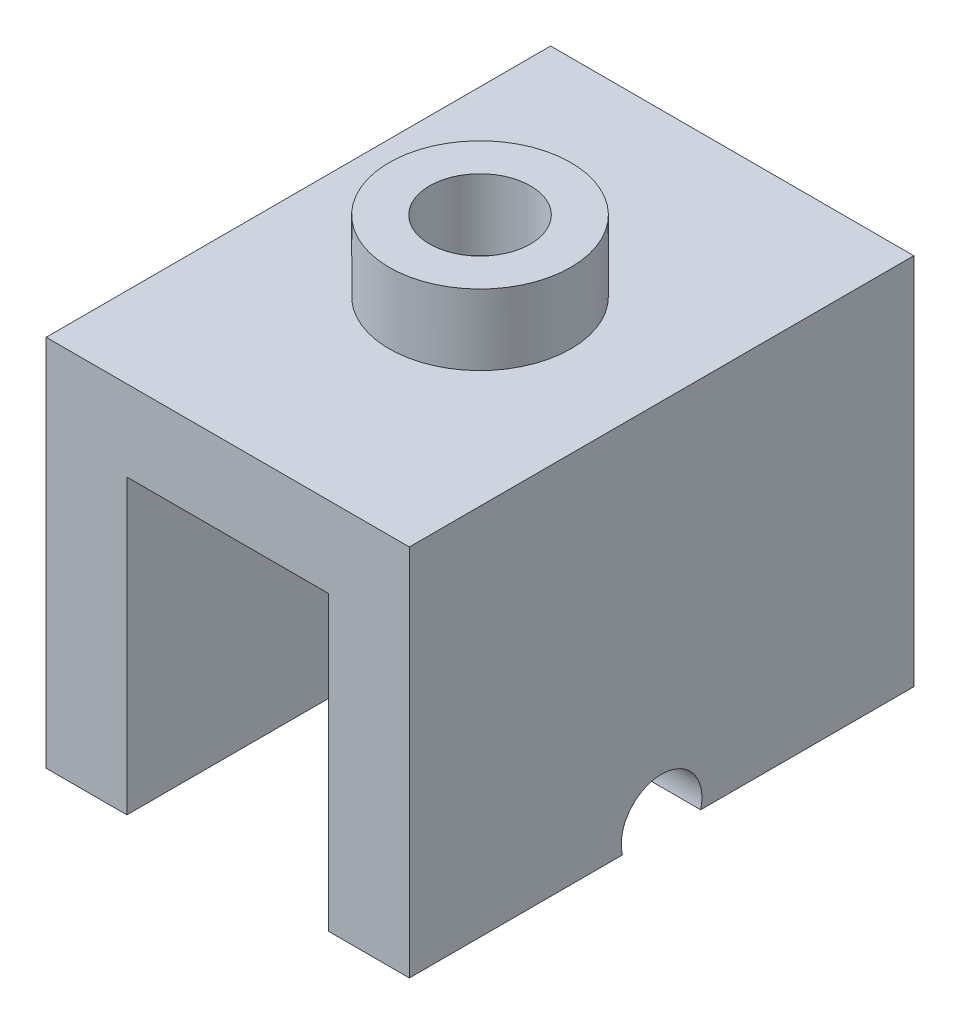
ISO-10303-21;
HEADER;
FILE_DESCRIPTION(('STEP AP214'),'2;1');
FILE_NAME('part.step','',(''),(''),'','','');
FILE_SCHEMA(('AUTOMOTIVE_DESIGN { 1 0 10303 214 1 1 1 1 }'));
ENDSEC;
DATA;
#1=APPLICATION_CONTEXT('core data for automotive mechanical design processes');
#2=APPLICATION_PROTOCOL_DEFINITION('international standard','automotive_design',2000,#1);
#3=PRODUCT_CONTEXT('',#1,'mechanical');
#4=PRODUCT('Part','Part','',(#3));
#5=PRODUCT_RELATED_PRODUCT_CATEGORY('part','',(#4));
#6=PRODUCT_DEFINITION_FORMATION('','',#4);
#7=PRODUCT_DEFINITION_CONTEXT('part definition',#1,'design');
#8=PRODUCT_DEFINITION('design','',#6,#7);
#9=PRODUCT_DEFINITION_SHAPE('','',#8);
#10=(LENGTH_UNIT() NAMED_UNIT(*) SI_UNIT(.MILLI.,.METRE.));
#11=(NAMED_UNIT(*) PLANE_ANGLE_UNIT() SI_UNIT($,.RADIAN.));
#12=(NAMED_UNIT(*) SI_UNIT($,.STERADIAN.) SOLID_ANGLE_UNIT());
#13=UNCERTAINTY_MEASURE_WITH_UNIT(LENGTH_MEASURE(1.E-05),#10,'distance_accuracy_value','');
#14=(GEOMETRIC_REPRESENTATION_CONTEXT(3) GLOBAL_UNCERTAINTY_ASSIGNED_CONTEXT((#13)) GLOBAL_UNIT_ASSIGNED_CONTEXT((#10,
#11,#12)) REPRESENTATION_CONTEXT('',''));
#15=CARTESIAN_POINT('',(0.,0.,0.));
#16=DIRECTION('',(0.,0.,1.));
#17=DIRECTION('',(1.,0.,0.));
#18=AXIS2_PLACEMENT_3D('',#15,#16,#17);
#19=CARTESIAN_POINT('',(-5.,-18.5,12.5));
#20=DIRECTION('',(0.,1.,0.));
#21=DIRECTION('',(0.,0.,1.));
#22=AXIS2_PLACEMENT_3D('',#19,#20,#21);
#23=PLANE('',#22);
#24=DIRECTION('',(0.,0.,-1.));
#25=VECTOR('',#24,1.);
#26=CARTESIAN_POINT('',(-9.,-18.5,12.5));
#27=LINE('',#26,#25);
#28=CARTESIAN_POINT('',(-9.,-18.5,12.5));
#29=VERTEX_POINT('',#28);
#30=CARTESIAN_POINT('',(-9.,-18.5,1.93649167310372));
#31=VERTEX_POINT('',#30);
#32=EDGE_CURVE('E147',#29,#31,#27,.T.);
#33=ORIENTED_EDGE('',*,*,#32,.T.);
#34=DIRECTION('',(1.,0.,0.));
#35=VECTOR('',#34,1.);
#36=CARTESIAN_POINT('',(-14.6568542494924,-18.5,1.93649167310372));
#37=LINE('',#36,#35);
#38=CARTESIAN_POINT('',(-5.,-18.5,1.93649167310371));
#39=VERTEX_POINT('',#38);
#40=EDGE_CURVE('E128',#31,#39,#37,.T.);
#41=ORIENTED_EDGE('',*,*,#40,.T.);
#42=DIRECTION('',(0.,0.,-1.));
#43=VECTOR('',#42,1.);
#44=CARTESIAN_POINT('',(-5.,-18.5,12.5));
#45=LINE('',#44,#43);
#46=CARTESIAN_POINT('',(-5.,-18.5,12.5));
#47=VERTEX_POINT('',#46);
#48=EDGE_CURVE('E148',#47,#39,#45,.T.);
#49=ORIENTED_EDGE('',*,*,#48,.F.);
#50=DIRECTION('',(1.,0.,0.));
#51=VECTOR('',#50,1.);
#52=CARTESIAN_POINT('',(-5.,-18.5,12.5));
#53=LINE('',#52,#51);
#54=EDGE_CURVE('E246',#29,#47,#53,.T.);
#55=ORIENTED_EDGE('',*,*,#54,.F.);
#56=EDGE_LOOP('',(#33,#41,#49,#55));
#57=FACE_BOUND('',#56,.T.);
#58=ADVANCED_FACE('F39',(#57),#23,.F.);
#59=CARTESIAN_POINT('',(9.,-18.5,12.5));
#60=DIRECTION('',(0.,1.,0.));
#61=DIRECTION('',(0.,0.,1.));
#62=AXIS2_PLACEMENT_3D('',#59,#60,#61);
#63=PLANE('',#62);
#64=DIRECTION('',(0.,0.,-1.));
#65=VECTOR('',#64,1.);
#66=CARTESIAN_POINT('',(5.,-18.5,12.5));
#67=LINE('',#66,#65);
#68=CARTESIAN_POINT('',(5.,-18.5,12.5));
#69=VERTEX_POINT('',#68);
#70=CARTESIAN_POINT('',(5.,-18.5,1.93649167310371));
#71=VERTEX_POINT('',#70);
#72=EDGE_CURVE('E211',#69,#71,#67,.T.);
#73=ORIENTED_EDGE('',*,*,#72,.T.);
#74=DIRECTION('',(1.,0.,0.));
#75=VECTOR('',#74,1.);
#76=CARTESIAN_POINT('',(-14.6568542494924,-18.5,1.93649167310372));
#77=LINE('',#76,#75);
#78=CARTESIAN_POINT('',(9.,-18.5,1.93649167310371));
#79=VERTEX_POINT('',#78);
#80=EDGE_CURVE('E260',#71,#79,#77,.T.);
#81=ORIENTED_EDGE('',*,*,#80,.T.);
#82=DIRECTION('',(0.,0.,-1.));
#83=VECTOR('',#82,1.);
#84=CARTESIAN_POINT('',(9.,-18.5,12.5));
#85=LINE('',#84,#83);
#86=CARTESIAN_POINT('',(9.,-18.5,12.5));
#87=VERTEX_POINT('',#86);
#88=EDGE_CURVE('E207',#87,#79,#85,.T.);
#89=ORIENTED_EDGE('',*,*,#88,.F.);
#90=DIRECTION('',(1.,0.,0.));
#91=VECTOR('',#90,1.);
#92=CARTESIAN_POINT('',(9.,-18.5,12.5));
#93=LINE('',#92,#91);
#94=EDGE_CURVE('E237',#69,#87,#93,.T.);
#95=ORIENTED_EDGE('',*,*,#94,.F.);
#96=EDGE_LOOP('',(#73,#81,#89,#95));
#97=FACE_BOUND('',#96,.T.);
#98=ADVANCED_FACE('F269',(#97),#63,.F.);
#99=CARTESIAN_POINT('',(-9.,-18.5,12.5));
#100=DIRECTION('',(1.,0.,0.));
#101=DIRECTION('',(0.,1.,0.));
#102=AXIS2_PLACEMENT_3D('',#99,#100,#101);
#103=PLANE('',#102);
#104=CARTESIAN_POINT('',(-9.,-18.5,-1.93649167310372));
#105=VERTEX_POINT('',#104);
#106=CARTESIAN_POINT('',(-9.,-18.5,-12.5));
#107=VERTEX_POINT('',#106);
#108=EDGE_CURVE('E138',#105,#107,#27,.T.);
#109=ORIENTED_EDGE('',*,*,#108,.F.);
#110=CARTESIAN_POINT('',(-9.,-18.,0.));
#111=DIRECTION('',(1.,0.,0.));
#112=DIRECTION('',(0.,1.,0.));
#113=AXIS2_PLACEMENT_3D('',#110,#111,#112);
#114=CIRCLE('',#113,2.00000000000001);
#115=EDGE_CURVE('E125',#31,#105,#114,.F.);
#116=ORIENTED_EDGE('',*,*,#115,.F.);
#117=ORIENTED_EDGE('',*,*,#32,.F.);
#118=DIRECTION('',(0.,-1.,0.));
#119=VECTOR('',#118,1.);
#120=CARTESIAN_POINT('',(-9.,-18.5,12.5));
#121=LINE('',#120,#119);
#122=CARTESIAN_POINT('',(-9.,0.,12.5));
#123=VERTEX_POINT('',#122);
#124=EDGE_CURVE('E176',#123,#29,#121,.T.);
#125=ORIENTED_EDGE('',*,*,#124,.F.);
#126=DIRECTION('',(0.,0.,-1.));
#127=VECTOR('',#126,1.);
#128=CARTESIAN_POINT('',(-9.,0.,12.5));
#129=LINE('',#128,#127);
#130=CARTESIAN_POINT('',(-9.,0.,-12.5));
#131=VERTEX_POINT('',#130);
#132=EDGE_CURVE('E170',#123,#131,#129,.T.);
#133=ORIENTED_EDGE('',*,*,#132,.T.);
#134=DIRECTION('',(0.,-1.,0.));
#135=VECTOR('',#134,1.);
#136=CARTESIAN_POINT('',(-9.,-18.5,-12.5));
#137=LINE('',#136,#135);
#138=EDGE_CURVE('E146',#131,#107,#137,.T.);
#139=ORIENTED_EDGE('',*,*,#138,.T.);
#140=EDGE_LOOP('',(#109,#116,#117,#125,#133,#139));
#141=FACE_BOUND('',#140,.T.);
#142=ADVANCED_FACE('F41',(#141),#103,.F.);
#143=CARTESIAN_POINT('',(-5.,-18.5,-1.93649167310371));
#144=VERTEX_POINT('',#143);
#145=CARTESIAN_POINT('',(-5.,-18.5,-12.5));
#146=VERTEX_POINT('',#145);
#147=EDGE_CURVE('E140',#144,#146,#45,.T.);
#148=ORIENTED_EDGE('',*,*,#147,.F.);
#149=DIRECTION('',(1.,0.,0.));
#150=VECTOR('',#149,1.);
#151=CARTESIAN_POINT('',(-14.6568542494924,-18.5,-1.93649167310372));
#152=LINE('',#151,#150);
#153=EDGE_CURVE('E54',#144,#105,#152,.F.);
#154=ORIENTED_EDGE('',*,*,#153,.T.);
#155=ORIENTED_EDGE('',*,*,#108,.T.);
#156=DIRECTION('',(1.,0.,0.));
#157=VECTOR('',#156,1.);
#158=CARTESIAN_POINT('',(-5.,-18.5,-12.5));
#159=LINE('',#158,#157);
#160=EDGE_CURVE('E184',#107,#146,#159,.T.);
#161=ORIENTED_EDGE('',*,*,#160,.T.);
#162=EDGE_LOOP('',(#148,#154,#155,#161));
#163=FACE_BOUND('',#162,.T.);
#164=ADVANCED_FACE('F136',(#163),#23,.F.);
#165=CARTESIAN_POINT('',(-5.,-3.99999999999999,12.5));
#166=DIRECTION('',(-1.,0.,0.));
#167=DIRECTION('',(0.,0.,1.));
#168=AXIS2_PLACEMENT_3D('',#165,#166,#167);
#169=PLANE('',#168);
#170=ORIENTED_EDGE('',*,*,#48,.T.);
#171=CARTESIAN_POINT('',(-5.,-18.,0.));
#172=DIRECTION('',(-1.,0.,0.));
#173=DIRECTION('',(0.,0.,1.));
#174=AXIS2_PLACEMENT_3D('',#171,#172,#173);
#175=CIRCLE('',#174,2.00000000000001);
#176=EDGE_CURVE('E141',#39,#144,#175,.T.);
#177=ORIENTED_EDGE('',*,*,#176,.T.);
#178=ORIENTED_EDGE('',*,*,#147,.T.);
#179=DIRECTION('',(0.,1.,0.));
#180=VECTOR('',#179,1.);
#181=CARTESIAN_POINT('',(-5.,-3.99999999999999,-12.5));
#182=LINE('',#181,#180);
#183=CARTESIAN_POINT('',(-5.,-3.99999999999999,-12.5));
#184=VERTEX_POINT('',#183);
#185=EDGE_CURVE('E187',#146,#184,#182,.T.);
#186=ORIENTED_EDGE('',*,*,#185,.T.);
#187=DIRECTION('',(0.,0.,-1.));
#188=VECTOR('',#187,1.);
#189=CARTESIAN_POINT('',(-5.,-3.99999999999999,12.5));
#190=LINE('',#189,#188);
#191=CARTESIAN_POINT('',(-5.,-3.99999999999999,12.5));
#192=VERTEX_POINT('',#191);
#193=EDGE_CURVE('E216',#192,#184,#190,.T.);
#194=ORIENTED_EDGE('',*,*,#193,.F.);
#195=DIRECTION('',(0.,1.,0.));
#196=VECTOR('',#195,1.);
#197=CARTESIAN_POINT('',(-5.,-3.99999999999999,12.5));
#198=LINE('',#197,#196);
#199=EDGE_CURVE('E242',#47,#192,#198,.T.);
#200=ORIENTED_EDGE('',*,*,#199,.F.);
#201=EDGE_LOOP('',(#170,#177,#178,#186,#194,#200));
#202=FACE_BOUND('',#201,.T.);
#203=ADVANCED_FACE('F223',(#202),#169,.F.);
#204=CARTESIAN_POINT('',(5.,-4.,12.5));
#205=DIRECTION('',(0.,1.,0.));
#206=DIRECTION('',(-1.,0.,0.));
#207=AXIS2_PLACEMENT_3D('',#204,#205,#206);
#208=PLANE('',#207);
#209=DIRECTION('',(1.,0.,0.));
#210=VECTOR('',#209,1.);
#211=CARTESIAN_POINT('',(5.,-4.,-12.5));
#212=LINE('',#211,#210);
#213=CARTESIAN_POINT('',(5.,-4.,-12.5));
#214=VERTEX_POINT('',#213);
#215=EDGE_CURVE('E196',#184,#214,#212,.T.);
#216=ORIENTED_EDGE('',*,*,#215,.T.);
#217=DIRECTION('',(0.,0.,-1.));
#218=VECTOR('',#217,1.);
#219=CARTESIAN_POINT('',(5.,-4.,12.5));
#220=LINE('',#219,#218);
#221=CARTESIAN_POINT('',(5.,-4.,12.5));
#222=VERTEX_POINT('',#221);
#223=EDGE_CURVE('E214',#222,#214,#220,.T.);
#224=ORIENTED_EDGE('',*,*,#223,.F.);
#225=DIRECTION('',(1.,0.,0.));
#226=VECTOR('',#225,1.);
#227=CARTESIAN_POINT('',(5.,-4.,12.5));
#228=LINE('',#227,#226);
#229=EDGE_CURVE('E238',#192,#222,#228,.T.);
#230=ORIENTED_EDGE('',*,*,#229,.F.);
#231=ORIENTED_EDGE('',*,*,#193,.T.);
#232=EDGE_LOOP('',(#216,#224,#230,#231));
#233=FACE_BOUND('',#232,.T.);
#234=ADVANCED_FACE('F227',(#233),#208,.F.);
#235=CARTESIAN_POINT('',(5.,-18.5,12.5));
#236=DIRECTION('',(1.,0.,0.));
#237=DIRECTION('',(0.,0.,-1.));
#238=AXIS2_PLACEMENT_3D('',#235,#236,#237);
#239=PLANE('',#238);
#240=CARTESIAN_POINT('',(5.,-18.5,-1.93649167310372));
#241=VERTEX_POINT('',#240);
#242=CARTESIAN_POINT('',(5.,-18.5,-12.5));
#243=VERTEX_POINT('',#242);
#244=EDGE_CURVE('E210',#241,#243,#67,.T.);
#245=ORIENTED_EDGE('',*,*,#244,.F.);
#246=CARTESIAN_POINT('',(5.,-18.,0.));
#247=DIRECTION('',(1.,0.,0.));
#248=DIRECTION('',(0.,0.,-1.));
#249=AXIS2_PLACEMENT_3D('',#246,#247,#248);
#250=CIRCLE('',#249,2.00000000000001);
#251=EDGE_CURVE('E263',#241,#71,#250,.T.);
#252=ORIENTED_EDGE('',*,*,#251,.T.);
#253=ORIENTED_EDGE('',*,*,#72,.F.);
#254=DIRECTION('',(0.,-1.,0.));
#255=VECTOR('',#254,1.);
#256=CARTESIAN_POINT('',(5.,-18.5,12.5));
#257=LINE('',#256,#255);
#258=EDGE_CURVE('E233',#222,#69,#257,.T.);
#259=ORIENTED_EDGE('',*,*,#258,.F.);
#260=ORIENTED_EDGE('',*,*,#223,.T.);
#261=DIRECTION('',(0.,-1.,0.));
#262=VECTOR('',#261,1.);
#263=CARTESIAN_POINT('',(5.,-18.5,-12.5));
#264=LINE('',#263,#262);
#265=EDGE_CURVE('E198',#214,#243,#264,.T.);
#266=ORIENTED_EDGE('',*,*,#265,.T.);
#267=EDGE_LOOP('',(#245,#252,#253,#259,#260,#266));
#268=FACE_BOUND('',#267,.T.);
#269=ADVANCED_FACE('F231',(#268),#239,.F.);
#270=CARTESIAN_POINT('',(9.,-18.5,-1.93649167310371));
#271=VERTEX_POINT('',#270);
#272=CARTESIAN_POINT('',(9.,-18.5,-12.5));
#273=VERTEX_POINT('',#272);
#274=EDGE_CURVE('E206',#271,#273,#85,.T.);
#275=ORIENTED_EDGE('',*,*,#274,.F.);
#276=DIRECTION('',(1.,0.,0.));
#277=VECTOR('',#276,1.);
#278=CARTESIAN_POINT('',(-14.6568542494924,-18.5,-1.93649167310372));
#279=LINE('',#278,#277);
#280=EDGE_CURVE('E62',#271,#241,#279,.F.);
#281=ORIENTED_EDGE('',*,*,#280,.T.);
#282=ORIENTED_EDGE('',*,*,#244,.T.);
#283=DIRECTION('',(1.,0.,0.));
#284=VECTOR('',#283,1.);
#285=CARTESIAN_POINT('',(9.,-18.5,-12.5));
#286=LINE('',#285,#284);
#287=EDGE_CURVE('E201',#243,#273,#286,.T.);
#288=ORIENTED_EDGE('',*,*,#287,.T.);
#289=EDGE_LOOP('',(#275,#281,#282,#288));
#290=FACE_BOUND('',#289,.T.);
#291=ADVANCED_FACE('F267',(#290),#63,.F.);
#292=CARTESIAN_POINT('',(9.,0.,12.5));
#293=DIRECTION('',(-1.,0.,0.));
#294=DIRECTION('',(0.,-1.,0.));
#295=AXIS2_PLACEMENT_3D('',#292,#293,#294);
#296=PLANE('',#295);
#297=ORIENTED_EDGE('',*,*,#88,.T.);
#298=CARTESIAN_POINT('',(9.,-18.,0.));
#299=DIRECTION('',(-1.,0.,0.));
#300=DIRECTION('',(0.,-1.,0.));
#301=AXIS2_PLACEMENT_3D('',#298,#299,#300);
#302=CIRCLE('',#301,2.00000000000001);
#303=EDGE_CURVE('E12',#79,#271,#302,.T.);
#304=ORIENTED_EDGE('',*,*,#303,.T.);
#305=ORIENTED_EDGE('',*,*,#274,.T.);
#306=DIRECTION('',(0.,1.,0.));
#307=VECTOR('',#306,1.);
#308=CARTESIAN_POINT('',(9.,0.,-12.5));
#309=LINE('',#308,#307);
#310=CARTESIAN_POINT('',(9.,0.,-12.5));
#311=VERTEX_POINT('',#310);
#312=EDGE_CURVE('E177',#273,#311,#309,.T.);
#313=ORIENTED_EDGE('',*,*,#312,.T.);
#314=DIRECTION('',(0.,0.,-1.));
#315=VECTOR('',#314,1.);
#316=CARTESIAN_POINT('',(9.,0.,12.5));
#317=LINE('',#316,#315);
#318=CARTESIAN_POINT('',(9.,0.,12.5));
#319=VERTEX_POINT('',#318);
#320=EDGE_CURVE('E173',#319,#311,#317,.T.);
#321=ORIENTED_EDGE('',*,*,#320,.F.);
#322=DIRECTION('',(0.,1.,0.));
#323=VECTOR('',#322,1.);
#324=CARTESIAN_POINT('',(9.,0.,12.5));
#325=LINE('',#324,#323);
#326=EDGE_CURVE('E240',#87,#319,#325,.T.);
#327=ORIENTED_EDGE('',*,*,#326,.F.);
#328=EDGE_LOOP('',(#297,#304,#305,#313,#321,#327));
#329=FACE_BOUND('',#328,.T.);
#330=ADVANCED_FACE('F162',(#329),#296,.F.);
#331=CARTESIAN_POINT('',(-9.,0.,12.5));
#332=DIRECTION('',(0.,-1.,0.));
#333=DIRECTION('',(0.,0.,-1.));
#334=AXIS2_PLACEMENT_3D('',#331,#332,#333);
#335=PLANE('',#334);
#336=CARTESIAN_POINT('',(0.,0.,0.));
#337=DIRECTION('',(0.,-1.,0.));
#338=DIRECTION('',(0.,0.,-1.));
#339=AXIS2_PLACEMENT_3D('',#336,#337,#338);
#340=CIRCLE('',#339,4.5);
#341=CARTESIAN_POINT('',(0.,0.,-4.5));
#342=VERTEX_POINT('',#341);
#343=EDGE_CURVE('E47',#342,#342,#340,.F.);
#344=ORIENTED_EDGE('',*,*,#343,.F.);
#345=EDGE_LOOP('',(#344));
#346=FACE_BOUND('',#345,.T.);
#347=DIRECTION('',(-1.,0.,0.));
#348=VECTOR('',#347,1.);
#349=CARTESIAN_POINT('',(-9.,0.,-12.5));
#350=LINE('',#349,#348);
#351=EDGE_CURVE('E168',#311,#131,#350,.T.);
#352=ORIENTED_EDGE('',*,*,#351,.T.);
#353=ORIENTED_EDGE('',*,*,#132,.F.);
#354=DIRECTION('',(-1.,0.,0.));
#355=VECTOR('',#354,1.);
#356=CARTESIAN_POINT('',(-9.,0.,12.5));
#357=LINE('',#356,#355);
#358=EDGE_CURVE('E180',#319,#123,#357,.T.);
#359=ORIENTED_EDGE('',*,*,#358,.F.);
#360=ORIENTED_EDGE('',*,*,#320,.T.);
#361=EDGE_LOOP('',(#352,#353,#359,#360));
#362=FACE_BOUND('',#361,.T.);
#363=ADVANCED_FACE('F158',(#346,#362),#335,.F.);
#364=CARTESIAN_POINT('',(0.,0.,12.5));
#365=DIRECTION('',(0.,0.,-1.));
#366=DIRECTION('',(-1.,0.,0.));
#367=AXIS2_PLACEMENT_3D('',#364,#365,#366);
#368=PLANE('',#367);
#369=ORIENTED_EDGE('',*,*,#124,.T.);
#370=ORIENTED_EDGE('',*,*,#54,.T.);
#371=ORIENTED_EDGE('',*,*,#199,.T.);
#372=ORIENTED_EDGE('',*,*,#229,.T.);
#373=ORIENTED_EDGE('',*,*,#258,.T.);
#374=ORIENTED_EDGE('',*,*,#94,.T.);
#375=ORIENTED_EDGE('',*,*,#326,.T.);
#376=ORIENTED_EDGE('',*,*,#358,.T.);
#377=EDGE_LOOP('',(#369,#370,#371,#372,#373,#374,#375,#376));
#378=FACE_BOUND('',#377,.T.);
#379=ADVANCED_FACE('F161',(#378),#368,.F.);
#380=CARTESIAN_POINT('',(0.,0.,-12.5));
#381=DIRECTION('',(0.,0.,-1.));
#382=DIRECTION('',(-1.,0.,0.));
#383=AXIS2_PLACEMENT_3D('',#380,#381,#382);
#384=PLANE('',#383);
#385=ORIENTED_EDGE('',*,*,#138,.F.);
#386=ORIENTED_EDGE('',*,*,#351,.F.);
#387=ORIENTED_EDGE('',*,*,#312,.F.);
#388=ORIENTED_EDGE('',*,*,#287,.F.);
#389=ORIENTED_EDGE('',*,*,#265,.F.);
#390=ORIENTED_EDGE('',*,*,#215,.F.);
#391=ORIENTED_EDGE('',*,*,#185,.F.);
#392=ORIENTED_EDGE('',*,*,#160,.F.);
#393=EDGE_LOOP('',(#385,#386,#387,#388,#389,#390,#391,#392));
#394=FACE_BOUND('',#393,.T.);
#395=ADVANCED_FACE('F182',(#394),#384,.T.);
#396=CARTESIAN_POINT('',(0.,3.5,0.));
#397=DIRECTION('',(0.,1.,0.));
#398=DIRECTION('',(-1.,0.,0.));
#399=AXIS2_PLACEMENT_3D('',#396,#397,#398);
#400=PLANE('',#399);
#401=CARTESIAN_POINT('',(0.,3.5,0.));
#402=DIRECTION('',(0.,1.,0.));
#403=DIRECTION('',(1.,0.,0.));
#404=AXIS2_PLACEMENT_3D('',#401,#402,#403);
#405=CIRCLE('',#404,4.5);
#406=CARTESIAN_POINT('',(4.5,3.5,0.));
#407=VERTEX_POINT('',#406);
#408=EDGE_CURVE('E185',#407,#407,#405,.T.);
#409=ORIENTED_EDGE('',*,*,#408,.T.);
#410=EDGE_LOOP('',(#409));
#411=FACE_BOUND('',#410,.T.);
#412=CARTESIAN_POINT('',(0.,3.5,0.));
#413=DIRECTION('',(0.,1.,0.));
#414=DIRECTION('',(-1.,0.,0.));
#415=AXIS2_PLACEMENT_3D('',#412,#413,#414);
#416=CIRCLE('',#415,2.5);
#417=CARTESIAN_POINT('',(-2.5,3.5,0.));
#418=VERTEX_POINT('',#417);
#419=EDGE_CURVE('E190',#418,#418,#416,.T.);
#420=ORIENTED_EDGE('',*,*,#419,.F.);
#421=EDGE_LOOP('',(#420));
#422=FACE_BOUND('',#421,.T.);
#423=ADVANCED_FACE('F329',(#411,#422),#400,.T.);
#424=CARTESIAN_POINT('',(0.,3.5,0.));
#425=DIRECTION('',(0.,-1.,0.));
#426=DIRECTION('',(1.,0.,0.));
#427=AXIS2_PLACEMENT_3D('',#424,#425,#426);
#428=CYLINDRICAL_SURFACE('',#427,4.5);
#429=ORIENTED_EDGE('',*,*,#408,.F.);
#430=EDGE_LOOP('',(#429));
#431=FACE_BOUND('',#430,.T.);
#432=ORIENTED_EDGE('',*,*,#343,.T.);
#433=EDGE_LOOP('',(#432));
#434=FACE_BOUND('',#433,.T.);
#435=ADVANCED_FACE('F156',(#431,#434),#428,.T.);
#436=CARTESIAN_POINT('',(0.,3.5,0.));
#437=DIRECTION('',(0.,-1.,0.));
#438=DIRECTION('',(1.,0.,0.));
#439=AXIS2_PLACEMENT_3D('',#436,#437,#438);
#440=CYLINDRICAL_SURFACE('',#439,2.5);
#441=ORIENTED_EDGE('',*,*,#419,.T.);
#442=EDGE_LOOP('',(#441));
#443=FACE_BOUND('',#442,.T.);
#444=CARTESIAN_POINT('',(0.,0.,0.));
#445=DIRECTION('',(0.,1.,0.));
#446=DIRECTION('',(-1.,0.,0.));
#447=AXIS2_PLACEMENT_3D('',#444,#445,#446);
#448=CIRCLE('',#447,2.5);
#449=CARTESIAN_POINT('',(-2.5,0.,0.));
#450=VERTEX_POINT('',#449);
#451=EDGE_CURVE('E253',#450,#450,#448,.T.);
#452=ORIENTED_EDGE('',*,*,#451,.F.);
#453=EDGE_LOOP('',(#452));
#454=FACE_BOUND('',#453,.T.);
#455=ADVANCED_FACE('F279',(#443,#454),#440,.F.);
#456=ORIENTED_EDGE('',*,*,#451,.T.);
#457=EDGE_LOOP('',(#456));
#458=FACE_BOUND('',#457,.T.);
#459=ADVANCED_FACE('F164',(#458),#335,.F.);
#460=CARTESIAN_POINT('',(-14.6568542494924,-18.,0.));
#461=DIRECTION('',(1.,0.,0.));
#462=DIRECTION('',(0.,1.,0.));
#463=AXIS2_PLACEMENT_3D('',#460,#461,#462);
#464=CYLINDRICAL_SURFACE('',#463,2.00000000000001);
#465=ORIENTED_EDGE('',*,*,#251,.F.);
#466=ORIENTED_EDGE('',*,*,#280,.F.);
#467=ORIENTED_EDGE('',*,*,#303,.F.);
#468=ORIENTED_EDGE('',*,*,#80,.F.);
#469=EDGE_LOOP('',(#465,#466,#467,#468));
#470=FACE_BOUND('',#469,.T.);
#471=ADVANCED_FACE('F272',(#470),#464,.F.);
#472=ORIENTED_EDGE('',*,*,#115,.T.);
#473=ORIENTED_EDGE('',*,*,#153,.F.);
#474=ORIENTED_EDGE('',*,*,#176,.F.);
#475=ORIENTED_EDGE('',*,*,#40,.F.);
#476=EDGE_LOOP('',(#472,#473,#474,#475));
#477=FACE_BOUND('',#476,.T.);
#478=ADVANCED_FACE('F126',(#477),#464,.F.);
#479=CLOSED_SHELL('',(#58,#98,#142,#164,#203,#234,#269,#291,#330,#363,#379,#395,#423,#435,#455,
#459,#471,#478));
#480=MANIFOLD_SOLID_BREP('B2',#479);
#481=ADVANCED_BREP_SHAPE_REPRESENTATION('',(#18,#480),#14);
#482=SHAPE_DEFINITION_REPRESENTATION(#9,#481);
ENDSEC;
END-ISO-10303-21;
